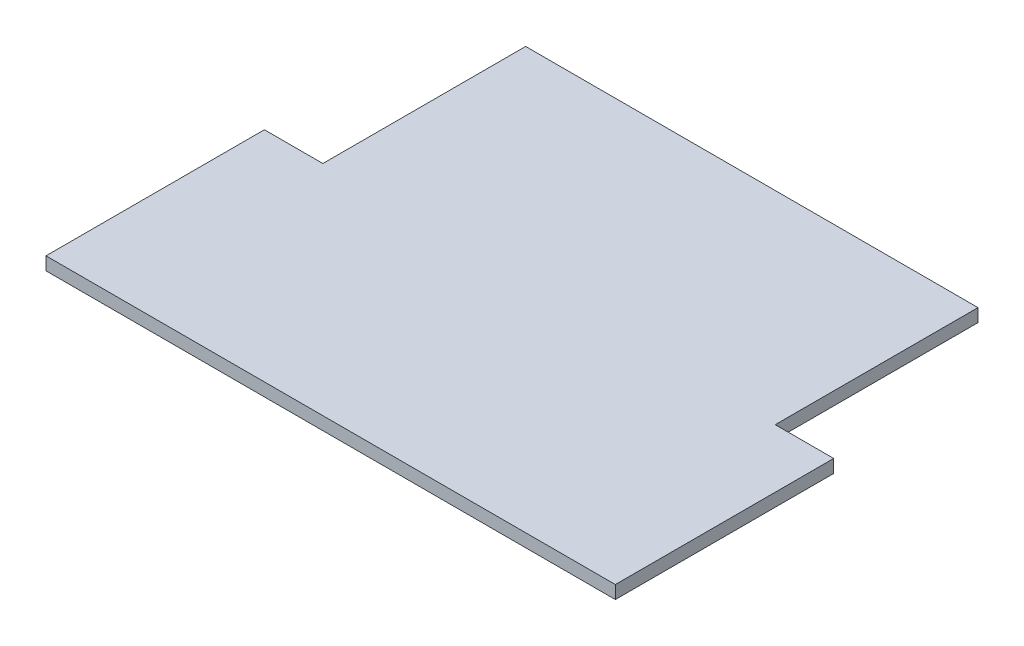
ISO-10303-21;
HEADER;
FILE_DESCRIPTION(('STEP AP214'),'2;1');
FILE_NAME('part.step','',(''),(''),'','','');
FILE_SCHEMA(('AUTOMOTIVE_DESIGN { 1 0 10303 214 1 1 1 1 }'));
ENDSEC;
DATA;
#1=APPLICATION_CONTEXT('core data for automotive mechanical design processes');
#2=APPLICATION_PROTOCOL_DEFINITION('international standard','automotive_design',2000,#1);
#3=PRODUCT_CONTEXT('',#1,'mechanical');
#4=PRODUCT('Part','Part','',(#3));
#5=PRODUCT_RELATED_PRODUCT_CATEGORY('part','',(#4));
#6=PRODUCT_DEFINITION_FORMATION('','',#4);
#7=PRODUCT_DEFINITION_CONTEXT('part definition',#1,'design');
#8=PRODUCT_DEFINITION('design','',#6,#7);
#9=PRODUCT_DEFINITION_SHAPE('','',#8);
#10=(LENGTH_UNIT() NAMED_UNIT(*) SI_UNIT(.MILLI.,.METRE.));
#11=(NAMED_UNIT(*) PLANE_ANGLE_UNIT() SI_UNIT($,.RADIAN.));
#12=(NAMED_UNIT(*) SI_UNIT($,.STERADIAN.) SOLID_ANGLE_UNIT());
#13=UNCERTAINTY_MEASURE_WITH_UNIT(LENGTH_MEASURE(1.E-05),#10,'distance_accuracy_value','');
#14=(GEOMETRIC_REPRESENTATION_CONTEXT(3) GLOBAL_UNCERTAINTY_ASSIGNED_CONTEXT((#13)) GLOBAL_UNIT_ASSIGNED_CONTEXT((#10,
#11,#12)) REPRESENTATION_CONTEXT('',''));
#15=CARTESIAN_POINT('',(0.,0.,0.));
#16=DIRECTION('',(0.,0.,1.));
#17=DIRECTION('',(1.,0.,0.));
#18=AXIS2_PLACEMENT_3D('',#15,#16,#17);
#19=CARTESIAN_POINT('',(36.5,1.67,27.));
#20=DIRECTION('',(0.,0.,-1.));
#21=DIRECTION('',(-1.,0.,0.));
#22=AXIS2_PLACEMENT_3D('',#19,#20,#21);
#23=PLANE('',#22);
#24=DIRECTION('',(1.,0.,0.));
#25=VECTOR('',#24,1.);
#26=CARTESIAN_POINT('',(36.5,0.,27.));
#27=LINE('',#26,#25);
#28=CARTESIAN_POINT('',(-36.5,0.,27.));
#29=VERTEX_POINT('',#28);
#30=CARTESIAN_POINT('',(36.5,0.,27.));
#31=VERTEX_POINT('',#30);
#32=EDGE_CURVE('E132',#29,#31,#27,.T.);
#33=ORIENTED_EDGE('',*,*,#32,.T.);
#34=DIRECTION('',(0.,-1.,0.));
#35=VECTOR('',#34,1.);
#36=CARTESIAN_POINT('',(36.5,1.67,27.));
#37=LINE('',#36,#35);
#38=CARTESIAN_POINT('',(36.5,1.67,27.));
#39=VERTEX_POINT('',#38);
#40=EDGE_CURVE('E11',#39,#31,#37,.T.);
#41=ORIENTED_EDGE('',*,*,#40,.F.);
#42=DIRECTION('',(1.,0.,0.));
#43=VECTOR('',#42,1.);
#44=CARTESIAN_POINT('',(36.5,1.67,27.));
#45=LINE('',#44,#43);
#46=CARTESIAN_POINT('',(-36.5,1.67,27.));
#47=VERTEX_POINT('',#46);
#48=EDGE_CURVE('E146',#47,#39,#45,.T.);
#49=ORIENTED_EDGE('',*,*,#48,.F.);
#50=DIRECTION('',(0.,-1.,0.));
#51=VECTOR('',#50,1.);
#52=CARTESIAN_POINT('',(-36.5,1.67,27.));
#53=LINE('',#52,#51);
#54=EDGE_CURVE('E128',#47,#29,#53,.T.);
#55=ORIENTED_EDGE('',*,*,#54,.T.);
#56=EDGE_LOOP('',(#33,#41,#49,#55));
#57=FACE_BOUND('',#56,.T.);
#58=ADVANCED_FACE('F36',(#57),#23,.F.);
#59=CARTESIAN_POINT('',(36.5,1.67,27.));
#60=DIRECTION('',(-1.,0.,0.));
#61=DIRECTION('',(0.,0.,1.));
#62=AXIS2_PLACEMENT_3D('',#59,#60,#61);
#63=PLANE('',#62);
#64=DIRECTION('',(0.,0.,-1.));
#65=VECTOR('',#64,1.);
#66=CARTESIAN_POINT('',(36.5,0.,27.));
#67=LINE('',#66,#65);
#68=CARTESIAN_POINT('',(36.5,0.,-1.00000000000001));
#69=VERTEX_POINT('',#68);
#70=EDGE_CURVE('E135',#31,#69,#67,.T.);
#71=ORIENTED_EDGE('',*,*,#70,.T.);
#72=DIRECTION('',(0.,-1.,0.));
#73=VECTOR('',#72,1.);
#74=CARTESIAN_POINT('',(36.5,1.67,-1.00000000000001));
#75=LINE('',#74,#73);
#76=CARTESIAN_POINT('',(36.5,1.67,-1.00000000000001));
#77=VERTEX_POINT('',#76);
#78=EDGE_CURVE('E44',#77,#69,#75,.T.);
#79=ORIENTED_EDGE('',*,*,#78,.F.);
#80=DIRECTION('',(0.,0.,-1.));
#81=VECTOR('',#80,1.);
#82=CARTESIAN_POINT('',(36.5,1.67,27.));
#83=LINE('',#82,#81);
#84=EDGE_CURVE('E95',#39,#77,#83,.T.);
#85=ORIENTED_EDGE('',*,*,#84,.F.);
#86=ORIENTED_EDGE('',*,*,#40,.T.);
#87=EDGE_LOOP('',(#71,#79,#85,#86));
#88=FACE_BOUND('',#87,.T.);
#89=ADVANCED_FACE('F181',(#88),#63,.F.);
#90=CARTESIAN_POINT('',(36.5,1.67,-1.00000000000001));
#91=DIRECTION('',(0.,0.,1.));
#92=DIRECTION('',(1.,0.,0.));
#93=AXIS2_PLACEMENT_3D('',#90,#91,#92);
#94=PLANE('',#93);
#95=DIRECTION('',(-1.,0.,0.));
#96=VECTOR('',#95,1.);
#97=CARTESIAN_POINT('',(36.5,0.,-1.00000000000001));
#98=LINE('',#97,#96);
#99=CARTESIAN_POINT('',(29.,0.,-1.00000000000001));
#100=VERTEX_POINT('',#99);
#101=EDGE_CURVE('E137',#69,#100,#98,.T.);
#102=ORIENTED_EDGE('',*,*,#101,.T.);
#103=DIRECTION('',(0.,-1.,0.));
#104=VECTOR('',#103,1.);
#105=CARTESIAN_POINT('',(29.,1.67,-1.00000000000001));
#106=LINE('',#105,#104);
#107=CARTESIAN_POINT('',(29.,1.67,-1.00000000000001));
#108=VERTEX_POINT('',#107);
#109=EDGE_CURVE('E153',#108,#100,#106,.T.);
#110=ORIENTED_EDGE('',*,*,#109,.F.);
#111=DIRECTION('',(-1.,0.,0.));
#112=VECTOR('',#111,1.);
#113=CARTESIAN_POINT('',(36.5,1.67,-1.00000000000001));
#114=LINE('',#113,#112);
#115=EDGE_CURVE('E161',#77,#108,#114,.T.);
#116=ORIENTED_EDGE('',*,*,#115,.F.);
#117=ORIENTED_EDGE('',*,*,#78,.T.);
#118=EDGE_LOOP('',(#102,#110,#116,#117));
#119=FACE_BOUND('',#118,.T.);
#120=ADVANCED_FACE('F159',(#119),#94,.F.);
#121=CARTESIAN_POINT('',(29.,1.67,-1.00000000000001));
#122=DIRECTION('',(-1.,0.,0.));
#123=DIRECTION('',(0.,0.,1.));
#124=AXIS2_PLACEMENT_3D('',#121,#122,#123);
#125=PLANE('',#124);
#126=DIRECTION('',(0.,0.,-1.));
#127=VECTOR('',#126,1.);
#128=CARTESIAN_POINT('',(29.,0.,-1.00000000000001));
#129=LINE('',#128,#127);
#130=CARTESIAN_POINT('',(29.,0.,-27.));
#131=VERTEX_POINT('',#130);
#132=EDGE_CURVE('E139',#100,#131,#129,.T.);
#133=ORIENTED_EDGE('',*,*,#132,.T.);
#134=DIRECTION('',(0.,-1.,0.));
#135=VECTOR('',#134,1.);
#136=CARTESIAN_POINT('',(29.,1.67,-27.));
#137=LINE('',#136,#135);
#138=CARTESIAN_POINT('',(29.,1.67,-27.));
#139=VERTEX_POINT('',#138);
#140=EDGE_CURVE('E150',#139,#131,#137,.T.);
#141=ORIENTED_EDGE('',*,*,#140,.F.);
#142=DIRECTION('',(0.,0.,-1.));
#143=VECTOR('',#142,1.);
#144=CARTESIAN_POINT('',(29.,1.67,-1.00000000000001));
#145=LINE('',#144,#143);
#146=EDGE_CURVE('E173',#108,#139,#145,.T.);
#147=ORIENTED_EDGE('',*,*,#146,.F.);
#148=ORIENTED_EDGE('',*,*,#109,.T.);
#149=EDGE_LOOP('',(#133,#141,#147,#148));
#150=FACE_BOUND('',#149,.T.);
#151=ADVANCED_FACE('F169',(#150),#125,.F.);
#152=CARTESIAN_POINT('',(-29.,1.67,-27.));
#153=DIRECTION('',(0.,0.,1.));
#154=DIRECTION('',(1.,0.,0.));
#155=AXIS2_PLACEMENT_3D('',#152,#153,#154);
#156=PLANE('',#155);
#157=DIRECTION('',(-1.,0.,0.));
#158=VECTOR('',#157,1.);
#159=CARTESIAN_POINT('',(-29.,0.,-27.));
#160=LINE('',#159,#158);
#161=CARTESIAN_POINT('',(-29.,0.,-27.));
#162=VERTEX_POINT('',#161);
#163=EDGE_CURVE('E141',#131,#162,#160,.T.);
#164=ORIENTED_EDGE('',*,*,#163,.T.);
#165=DIRECTION('',(0.,-1.,0.));
#166=VECTOR('',#165,1.);
#167=CARTESIAN_POINT('',(-29.,1.67,-27.));
#168=LINE('',#167,#166);
#169=CARTESIAN_POINT('',(-29.,1.67,-27.));
#170=VERTEX_POINT('',#169);
#171=EDGE_CURVE('E123',#170,#162,#168,.T.);
#172=ORIENTED_EDGE('',*,*,#171,.F.);
#173=DIRECTION('',(-1.,0.,0.));
#174=VECTOR('',#173,1.);
#175=CARTESIAN_POINT('',(-29.,1.67,-27.));
#176=LINE('',#175,#174);
#177=EDGE_CURVE('E114',#139,#170,#176,.T.);
#178=ORIENTED_EDGE('',*,*,#177,.F.);
#179=ORIENTED_EDGE('',*,*,#140,.T.);
#180=EDGE_LOOP('',(#164,#172,#178,#179));
#181=FACE_BOUND('',#180,.T.);
#182=ADVANCED_FACE('F172',(#181),#156,.F.);
#183=CARTESIAN_POINT('',(-29.,1.67,-0.999999999999994));
#184=DIRECTION('',(1.,0.,0.));
#185=DIRECTION('',(0.,0.,-1.));
#186=AXIS2_PLACEMENT_3D('',#183,#184,#185);
#187=PLANE('',#186);
#188=DIRECTION('',(0.,0.,1.));
#189=VECTOR('',#188,1.);
#190=CARTESIAN_POINT('',(-29.,0.,-0.999999999999994));
#191=LINE('',#190,#189);
#192=CARTESIAN_POINT('',(-29.,0.,-0.999999999999994));
#193=VERTEX_POINT('',#192);
#194=EDGE_CURVE('E122',#162,#193,#191,.T.);
#195=ORIENTED_EDGE('',*,*,#194,.T.);
#196=DIRECTION('',(0.,-1.,0.));
#197=VECTOR('',#196,1.);
#198=CARTESIAN_POINT('',(-29.,1.67,-0.999999999999994));
#199=LINE('',#198,#197);
#200=CARTESIAN_POINT('',(-29.,1.67,-0.999999999999994));
#201=VERTEX_POINT('',#200);
#202=EDGE_CURVE('E119',#201,#193,#199,.T.);
#203=ORIENTED_EDGE('',*,*,#202,.F.);
#204=DIRECTION('',(0.,0.,1.));
#205=VECTOR('',#204,1.);
#206=CARTESIAN_POINT('',(-29.,1.67,-0.999999999999994));
#207=LINE('',#206,#205);
#208=EDGE_CURVE('E108',#170,#201,#207,.T.);
#209=ORIENTED_EDGE('',*,*,#208,.F.);
#210=ORIENTED_EDGE('',*,*,#171,.T.);
#211=EDGE_LOOP('',(#195,#203,#209,#210));
#212=FACE_BOUND('',#211,.T.);
#213=ADVANCED_FACE('F120',(#212),#187,.F.);
#214=CARTESIAN_POINT('',(-36.5,1.67,-0.999999999999994));
#215=DIRECTION('',(0.,0.,1.));
#216=DIRECTION('',(1.,0.,0.));
#217=AXIS2_PLACEMENT_3D('',#214,#215,#216);
#218=PLANE('',#217);
#219=DIRECTION('',(-1.,0.,0.));
#220=VECTOR('',#219,1.);
#221=CARTESIAN_POINT('',(-36.5,0.,-0.999999999999994));
#222=LINE('',#221,#220);
#223=CARTESIAN_POINT('',(-36.5,0.,-0.999999999999994));
#224=VERTEX_POINT('',#223);
#225=EDGE_CURVE('E81',#193,#224,#222,.T.);
#226=ORIENTED_EDGE('',*,*,#225,.T.);
#227=DIRECTION('',(0.,-1.,0.));
#228=VECTOR('',#227,1.);
#229=CARTESIAN_POINT('',(-36.5,1.67,-0.999999999999994));
#230=LINE('',#229,#228);
#231=CARTESIAN_POINT('',(-36.5,1.67,-0.999999999999994));
#232=VERTEX_POINT('',#231);
#233=EDGE_CURVE('E124',#232,#224,#230,.T.);
#234=ORIENTED_EDGE('',*,*,#233,.F.);
#235=DIRECTION('',(-1.,0.,0.));
#236=VECTOR('',#235,1.);
#237=CARTESIAN_POINT('',(-36.5,1.67,-0.999999999999994));
#238=LINE('',#237,#236);
#239=EDGE_CURVE('E112',#201,#232,#238,.T.);
#240=ORIENTED_EDGE('',*,*,#239,.F.);
#241=ORIENTED_EDGE('',*,*,#202,.T.);
#242=EDGE_LOOP('',(#226,#234,#240,#241));
#243=FACE_BOUND('',#242,.T.);
#244=ADVANCED_FACE('F126',(#243),#218,.F.);
#245=CARTESIAN_POINT('',(-36.5,1.67,27.));
#246=DIRECTION('',(1.,0.,0.));
#247=DIRECTION('',(0.,0.,-1.));
#248=AXIS2_PLACEMENT_3D('',#245,#246,#247);
#249=PLANE('',#248);
#250=DIRECTION('',(0.,0.,1.));
#251=VECTOR('',#250,1.);
#252=CARTESIAN_POINT('',(-36.5,0.,27.));
#253=LINE('',#252,#251);
#254=EDGE_CURVE('E87',#224,#29,#253,.T.);
#255=ORIENTED_EDGE('',*,*,#254,.T.);
#256=ORIENTED_EDGE('',*,*,#54,.F.);
#257=DIRECTION('',(0.,0.,1.));
#258=VECTOR('',#257,1.);
#259=CARTESIAN_POINT('',(-36.5,1.67,27.));
#260=LINE('',#259,#258);
#261=EDGE_CURVE('E52',#232,#47,#260,.T.);
#262=ORIENTED_EDGE('',*,*,#261,.F.);
#263=ORIENTED_EDGE('',*,*,#233,.T.);
#264=EDGE_LOOP('',(#255,#256,#262,#263));
#265=FACE_BOUND('',#264,.T.);
#266=ADVANCED_FACE('F197',(#265),#249,.F.);
#267=CARTESIAN_POINT('',(0.,1.67,0.));
#268=DIRECTION('',(0.,-1.,0.));
#269=DIRECTION('',(0.,0.,-1.));
#270=AXIS2_PLACEMENT_3D('',#267,#268,#269);
#271=PLANE('',#270);
#272=ORIENTED_EDGE('',*,*,#48,.T.);
#273=ORIENTED_EDGE('',*,*,#84,.T.);
#274=ORIENTED_EDGE('',*,*,#115,.T.);
#275=ORIENTED_EDGE('',*,*,#146,.T.);
#276=ORIENTED_EDGE('',*,*,#177,.T.);
#277=ORIENTED_EDGE('',*,*,#208,.T.);
#278=ORIENTED_EDGE('',*,*,#239,.T.);
#279=ORIENTED_EDGE('',*,*,#261,.T.);
#280=EDGE_LOOP('',(#272,#273,#274,#275,#276,#277,#278,#279));
#281=FACE_BOUND('',#280,.T.);
#282=ADVANCED_FACE('F110',(#281),#271,.F.);
#283=CARTESIAN_POINT('',(0.,0.,0.));
#284=DIRECTION('',(0.,-1.,0.));
#285=DIRECTION('',(0.,0.,-1.));
#286=AXIS2_PLACEMENT_3D('',#283,#284,#285);
#287=PLANE('',#286);
#288=ORIENTED_EDGE('',*,*,#32,.F.);
#289=ORIENTED_EDGE('',*,*,#254,.F.);
#290=ORIENTED_EDGE('',*,*,#225,.F.);
#291=ORIENTED_EDGE('',*,*,#194,.F.);
#292=ORIENTED_EDGE('',*,*,#163,.F.);
#293=ORIENTED_EDGE('',*,*,#132,.F.);
#294=ORIENTED_EDGE('',*,*,#101,.F.);
#295=ORIENTED_EDGE('',*,*,#70,.F.);
#296=EDGE_LOOP('',(#288,#289,#290,#291,#292,#293,#294,#295));
#297=FACE_BOUND('',#296,.T.);
#298=ADVANCED_FACE('F165',(#297),#287,.T.);
#299=CLOSED_SHELL('',(#58,#89,#120,#151,#182,#213,#244,#266,#282,#298));
#300=MANIFOLD_SOLID_BREP('B2',#299);
#301=ADVANCED_BREP_SHAPE_REPRESENTATION('',(#18,#300),#14);
#302=SHAPE_DEFINITION_REPRESENTATION(#9,#301);
ENDSEC;
END-ISO-10303-21;
